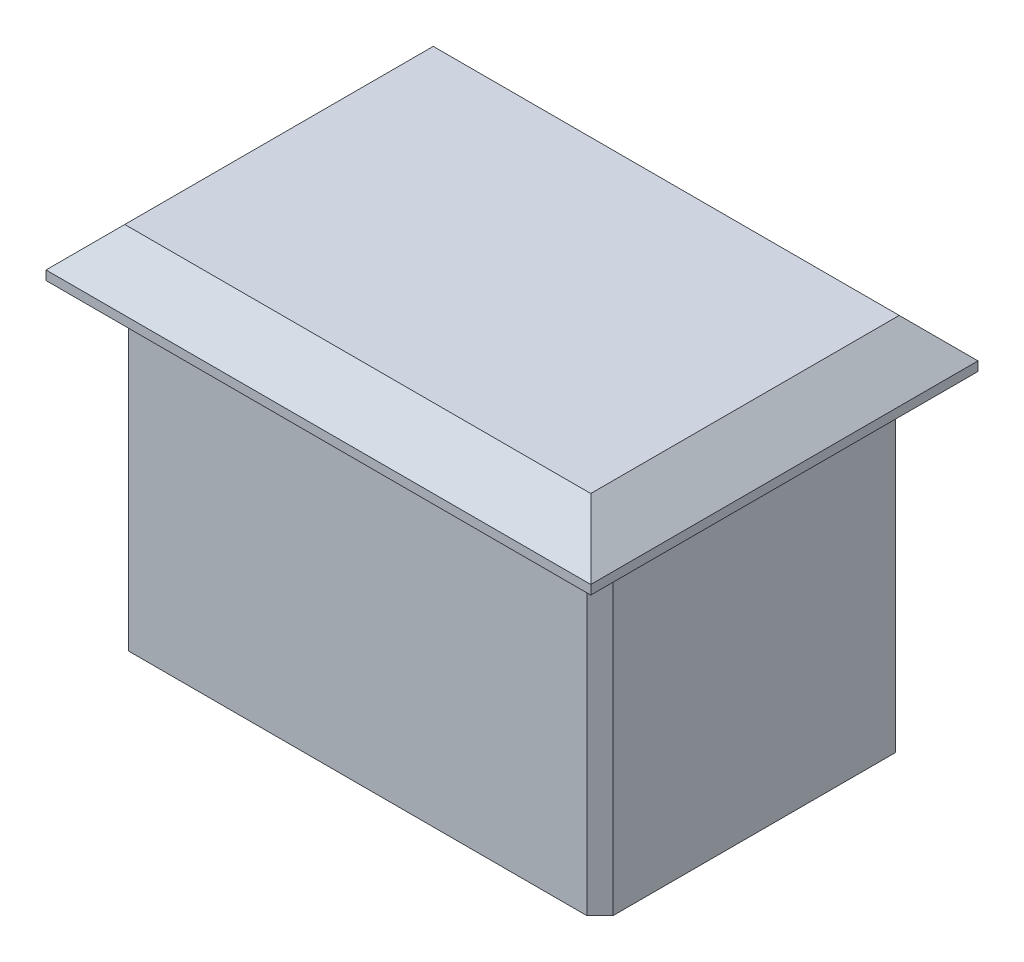
ISO-10303-21;
HEADER;
FILE_DESCRIPTION(('STEP AP214'),'2;1');
FILE_NAME('part.step','',(''),(''),'','','');
FILE_SCHEMA(('AUTOMOTIVE_DESIGN { 1 0 10303 214 1 1 1 1 }'));
ENDSEC;
DATA;
#1=APPLICATION_CONTEXT('core data for automotive mechanical design processes');
#2=APPLICATION_PROTOCOL_DEFINITION('international standard','automotive_design',2000,#1);
#3=PRODUCT_CONTEXT('',#1,'mechanical');
#4=PRODUCT('Part','Part','',(#3));
#5=PRODUCT_RELATED_PRODUCT_CATEGORY('part','',(#4));
#6=PRODUCT_DEFINITION_FORMATION('','',#4);
#7=PRODUCT_DEFINITION_CONTEXT('part definition',#1,'design');
#8=PRODUCT_DEFINITION('design','',#6,#7);
#9=PRODUCT_DEFINITION_SHAPE('','',#8);
#10=(LENGTH_UNIT() NAMED_UNIT(*) SI_UNIT(.MILLI.,.METRE.));
#11=(NAMED_UNIT(*) PLANE_ANGLE_UNIT() SI_UNIT($,.RADIAN.));
#12=(NAMED_UNIT(*) SI_UNIT($,.STERADIAN.) SOLID_ANGLE_UNIT());
#13=UNCERTAINTY_MEASURE_WITH_UNIT(LENGTH_MEASURE(1.E-05),#10,'distance_accuracy_value','');
#14=(GEOMETRIC_REPRESENTATION_CONTEXT(3) GLOBAL_UNCERTAINTY_ASSIGNED_CONTEXT((#13)) GLOBAL_UNIT_ASSIGNED_CONTEXT((#10,
#11,#12)) REPRESENTATION_CONTEXT('',''));
#15=CARTESIAN_POINT('',(0.,0.,0.));
#16=DIRECTION('',(0.,0.,1.));
#17=DIRECTION('',(1.,0.,0.));
#18=AXIS2_PLACEMENT_3D('',#15,#16,#17);
#19=CARTESIAN_POINT('',(-9.225,14.,-5.875));
#20=DIRECTION('',(1.,0.,0.));
#21=DIRECTION('',(0.,0.,-1.));
#22=AXIS2_PLACEMENT_3D('',#19,#20,#21);
#23=PLANE('',#22);
#24=DIRECTION('',(0.,0.,-1.));
#25=VECTOR('',#24,1.);
#26=CARTESIAN_POINT('',(-9.225,12.15,-5.875));
#27=LINE('',#26,#25);
#28=CARTESIAN_POINT('',(-9.225,12.15,5.375));
#29=VERTEX_POINT('',#28);
#30=CARTESIAN_POINT('',(-9.225,12.15,-5.375));
#31=VERTEX_POINT('',#30);
#32=EDGE_CURVE('E190',#29,#31,#27,.T.);
#33=ORIENTED_EDGE('',*,*,#32,.T.);
#34=DIRECTION('',(0.,-1.,0.));
#35=VECTOR('',#34,1.);
#36=CARTESIAN_POINT('',(-9.225,14.,-5.375));
#37=LINE('',#36,#35);
#38=CARTESIAN_POINT('',(-9.225,0.,-5.375));
#39=VERTEX_POINT('',#38);
#40=EDGE_CURVE('E248',#31,#39,#37,.T.);
#41=ORIENTED_EDGE('',*,*,#40,.T.);
#42=DIRECTION('',(0.,0.,1.));
#43=VECTOR('',#42,1.);
#44=CARTESIAN_POINT('',(-9.225,0.,-5.875));
#45=LINE('',#44,#43);
#46=CARTESIAN_POINT('',(-9.225,0.,5.375));
#47=VERTEX_POINT('',#46);
#48=EDGE_CURVE('E188',#39,#47,#45,.T.);
#49=ORIENTED_EDGE('',*,*,#48,.T.);
#50=DIRECTION('',(0.,1.,0.));
#51=VECTOR('',#50,1.);
#52=CARTESIAN_POINT('',(-9.225,14.,5.375));
#53=LINE('',#52,#51);
#54=EDGE_CURVE('E65',#47,#29,#53,.T.);
#55=ORIENTED_EDGE('',*,*,#54,.T.);
#56=EDGE_LOOP('',(#33,#41,#49,#55));
#57=FACE_BOUND('',#56,.T.);
#58=ADVANCED_FACE('F37',(#57),#23,.F.);
#59=CARTESIAN_POINT('',(9.225,14.,5.875));
#60=DIRECTION('',(0.,0.,-1.));
#61=DIRECTION('',(-1.,0.,0.));
#62=AXIS2_PLACEMENT_3D('',#59,#60,#61);
#63=PLANE('',#62);
#64=DIRECTION('',(1.,0.,0.));
#65=VECTOR('',#64,1.);
#66=CARTESIAN_POINT('',(9.225,0.,5.875));
#67=LINE('',#66,#65);
#68=CARTESIAN_POINT('',(-8.72500000000001,0.,5.875));
#69=VERTEX_POINT('',#68);
#70=CARTESIAN_POINT('',(8.72499999999999,0.,5.875));
#71=VERTEX_POINT('',#70);
#72=EDGE_CURVE('E192',#69,#71,#67,.T.);
#73=ORIENTED_EDGE('',*,*,#72,.T.);
#74=DIRECTION('',(0.,1.,0.));
#75=VECTOR('',#74,1.);
#76=CARTESIAN_POINT('',(8.72499999999999,14.,5.875));
#77=LINE('',#76,#75);
#78=CARTESIAN_POINT('',(8.72499999999999,12.15,5.875));
#79=VERTEX_POINT('',#78);
#80=EDGE_CURVE('E250',#71,#79,#77,.T.);
#81=ORIENTED_EDGE('',*,*,#80,.T.);
#82=DIRECTION('',(-1.,0.,0.));
#83=VECTOR('',#82,1.);
#84=CARTESIAN_POINT('',(9.225,12.15,5.875));
#85=LINE('',#84,#83);
#86=CARTESIAN_POINT('',(-8.72500000000001,12.15,5.875));
#87=VERTEX_POINT('',#86);
#88=EDGE_CURVE('E184',#79,#87,#85,.T.);
#89=ORIENTED_EDGE('',*,*,#88,.T.);
#90=DIRECTION('',(0.,-1.,0.));
#91=VECTOR('',#90,1.);
#92=CARTESIAN_POINT('',(-8.72500000000001,14.,5.875));
#93=LINE('',#92,#91);
#94=EDGE_CURVE('E243',#87,#69,#93,.T.);
#95=ORIENTED_EDGE('',*,*,#94,.T.);
#96=EDGE_LOOP('',(#73,#81,#89,#95));
#97=FACE_BOUND('',#96,.T.);
#98=ADVANCED_FACE('F272',(#97),#63,.F.);
#99=CARTESIAN_POINT('',(9.22499999999999,14.,-5.875));
#100=DIRECTION('',(-1.,0.,0.));
#101=DIRECTION('',(0.,0.,1.));
#102=AXIS2_PLACEMENT_3D('',#99,#100,#101);
#103=PLANE('',#102);
#104=DIRECTION('',(0.,0.,-1.));
#105=VECTOR('',#104,1.);
#106=CARTESIAN_POINT('',(9.22499999999999,0.,-5.875));
#107=LINE('',#106,#105);
#108=CARTESIAN_POINT('',(9.225,0.,5.375));
#109=VERTEX_POINT('',#108);
#110=CARTESIAN_POINT('',(9.22499999999999,0.,-5.375));
#111=VERTEX_POINT('',#110);
#112=EDGE_CURVE('E191',#109,#111,#107,.T.);
#113=ORIENTED_EDGE('',*,*,#112,.T.);
#114=DIRECTION('',(0.,1.,0.));
#115=VECTOR('',#114,1.);
#116=CARTESIAN_POINT('',(9.22499999999999,14.,-5.375));
#117=LINE('',#116,#115);
#118=CARTESIAN_POINT('',(9.22499999999999,12.15,-5.375));
#119=VERTEX_POINT('',#118);
#120=EDGE_CURVE('E245',#111,#119,#117,.T.);
#121=ORIENTED_EDGE('',*,*,#120,.T.);
#122=DIRECTION('',(0.,0.,1.));
#123=VECTOR('',#122,1.);
#124=CARTESIAN_POINT('',(9.22499999999999,12.15,-5.875));
#125=LINE('',#124,#123);
#126=CARTESIAN_POINT('',(9.225,12.15,5.375));
#127=VERTEX_POINT('',#126);
#128=EDGE_CURVE('E180',#119,#127,#125,.T.);
#129=ORIENTED_EDGE('',*,*,#128,.T.);
#130=DIRECTION('',(0.,-1.,0.));
#131=VECTOR('',#130,1.);
#132=CARTESIAN_POINT('',(9.225,14.,5.375));
#133=LINE('',#132,#131);
#134=EDGE_CURVE('E239',#127,#109,#133,.T.);
#135=ORIENTED_EDGE('',*,*,#134,.T.);
#136=EDGE_LOOP('',(#113,#121,#129,#135));
#137=FACE_BOUND('',#136,.T.);
#138=ADVANCED_FACE('F262',(#137),#103,.F.);
#139=CARTESIAN_POINT('',(9.22499999999999,14.,-5.875));
#140=DIRECTION('',(0.,0.,1.));
#141=DIRECTION('',(1.,0.,0.));
#142=AXIS2_PLACEMENT_3D('',#139,#140,#141);
#143=PLANE('',#142);
#144=DIRECTION('',(1.,0.,0.));
#145=VECTOR('',#144,1.);
#146=CARTESIAN_POINT('',(9.22499999999999,12.15,-5.875));
#147=LINE('',#146,#145);
#148=CARTESIAN_POINT('',(-8.725,12.15,-5.875));
#149=VERTEX_POINT('',#148);
#150=CARTESIAN_POINT('',(8.725,12.15,-5.875));
#151=VERTEX_POINT('',#150);
#152=EDGE_CURVE('E199',#149,#151,#147,.T.);
#153=ORIENTED_EDGE('',*,*,#152,.T.);
#154=DIRECTION('',(0.,-1.,0.));
#155=VECTOR('',#154,1.);
#156=CARTESIAN_POINT('',(8.725,14.,-5.875));
#157=LINE('',#156,#155);
#158=CARTESIAN_POINT('',(8.725,0.,-5.875));
#159=VERTEX_POINT('',#158);
#160=EDGE_CURVE('E227',#151,#159,#157,.T.);
#161=ORIENTED_EDGE('',*,*,#160,.T.);
#162=DIRECTION('',(-1.,0.,0.));
#163=VECTOR('',#162,1.);
#164=CARTESIAN_POINT('',(9.22499999999999,0.,-5.875));
#165=LINE('',#164,#163);
#166=CARTESIAN_POINT('',(-8.725,0.,-5.875));
#167=VERTEX_POINT('',#166);
#168=EDGE_CURVE('E197',#159,#167,#165,.T.);
#169=ORIENTED_EDGE('',*,*,#168,.T.);
#170=DIRECTION('',(0.,1.,0.));
#171=VECTOR('',#170,1.);
#172=CARTESIAN_POINT('',(-8.725,14.,-5.875));
#173=LINE('',#172,#171);
#174=EDGE_CURVE('E219',#167,#149,#173,.T.);
#175=ORIENTED_EDGE('',*,*,#174,.T.);
#176=EDGE_LOOP('',(#153,#161,#169,#175));
#177=FACE_BOUND('',#176,.T.);
#178=ADVANCED_FACE('F282',(#177),#143,.F.);
#179=CARTESIAN_POINT('',(0.,0.,0.));
#180=DIRECTION('',(0.,-1.,0.));
#181=DIRECTION('',(0.,0.,-1.));
#182=AXIS2_PLACEMENT_3D('',#179,#180,#181);
#183=PLANE('',#182);
#184=ORIENTED_EDGE('',*,*,#168,.F.);
#185=DIRECTION('',(-0.707106781186545,0.,-0.70710678118655));
#186=VECTOR('',#185,1.);
#187=CARTESIAN_POINT('',(7.30000000000003,0.,-7.29999999999998));
#188=LINE('',#187,#186);
#189=EDGE_CURVE('E240',#159,#111,#188,.F.);
#190=ORIENTED_EDGE('',*,*,#189,.T.);
#191=ORIENTED_EDGE('',*,*,#112,.F.);
#192=DIRECTION('',(0.70710678118655,0.,-0.707106781186545));
#193=VECTOR('',#192,1.);
#194=CARTESIAN_POINT('',(7.29999999999997,0.,7.30000000000002));
#195=LINE('',#194,#193);
#196=EDGE_CURVE('E233',#109,#71,#195,.F.);
#197=ORIENTED_EDGE('',*,*,#196,.T.);
#198=ORIENTED_EDGE('',*,*,#72,.F.);
#199=DIRECTION('',(0.707106781186544,0.,0.707106781186551));
#200=VECTOR('',#199,1.);
#201=CARTESIAN_POINT('',(-7.30000000000005,0.,7.29999999999997));
#202=LINE('',#201,#200);
#203=EDGE_CURVE('E232',#69,#47,#202,.F.);
#204=ORIENTED_EDGE('',*,*,#203,.T.);
#205=ORIENTED_EDGE('',*,*,#48,.F.);
#206=DIRECTION('',(-0.70710678118655,0.,0.707106781186545));
#207=VECTOR('',#206,1.);
#208=CARTESIAN_POINT('',(-7.29999999999997,0.,-7.30000000000002));
#209=LINE('',#208,#207);
#210=EDGE_CURVE('E234',#39,#167,#209,.F.);
#211=ORIENTED_EDGE('',*,*,#210,.T.);
#212=EDGE_LOOP('',(#184,#190,#191,#197,#198,#204,#205,#211));
#213=FACE_BOUND('',#212,.T.);
#214=ADVANCED_FACE('F271',(#213),#183,.T.);
#215=CARTESIAN_POINT('',(0.,12.15,0.));
#216=DIRECTION('',(0.,-1.,0.));
#217=DIRECTION('',(0.,0.,-1.));
#218=AXIS2_PLACEMENT_3D('',#215,#216,#217);
#219=PLANE('',#218);
#220=DIRECTION('',(0.,0.,1.));
#221=VECTOR('',#220,1.);
#222=CARTESIAN_POINT('',(-10.375,12.15,-7.375));
#223=LINE('',#222,#221);
#224=CARTESIAN_POINT('',(-10.375,12.15,-7.375));
#225=VERTEX_POINT('',#224);
#226=CARTESIAN_POINT('',(-10.375,12.15,7.375));
#227=VERTEX_POINT('',#226);
#228=EDGE_CURVE('E159',#225,#227,#223,.T.);
#229=ORIENTED_EDGE('',*,*,#228,.F.);
#230=DIRECTION('',(-1.,0.,0.));
#231=VECTOR('',#230,1.);
#232=CARTESIAN_POINT('',(10.375,12.15,-7.375));
#233=LINE('',#232,#231);
#234=CARTESIAN_POINT('',(10.375,12.15,-7.375));
#235=VERTEX_POINT('',#234);
#236=EDGE_CURVE('E153',#235,#225,#233,.T.);
#237=ORIENTED_EDGE('',*,*,#236,.F.);
#238=DIRECTION('',(0.,0.,-1.));
#239=VECTOR('',#238,1.);
#240=CARTESIAN_POINT('',(10.375,12.15,-7.375));
#241=LINE('',#240,#239);
#242=CARTESIAN_POINT('',(10.375,12.15,7.375));
#243=VERTEX_POINT('',#242);
#244=EDGE_CURVE('E162',#243,#235,#241,.T.);
#245=ORIENTED_EDGE('',*,*,#244,.F.);
#246=DIRECTION('',(1.,0.,0.));
#247=VECTOR('',#246,1.);
#248=CARTESIAN_POINT('',(10.375,12.15,7.375));
#249=LINE('',#248,#247);
#250=EDGE_CURVE('E148',#227,#243,#249,.T.);
#251=ORIENTED_EDGE('',*,*,#250,.F.);
#252=EDGE_LOOP('',(#229,#237,#245,#251));
#253=FACE_BOUND('',#252,.T.);
#254=ORIENTED_EDGE('',*,*,#32,.F.);
#255=DIRECTION('',(-0.707106781186544,0.,-0.707106781186551));
#256=VECTOR('',#255,1.);
#257=CARTESIAN_POINT('',(-8.72500000000001,12.15,5.875));
#258=LINE('',#257,#256);
#259=EDGE_CURVE('E11',#29,#87,#258,.F.);
#260=ORIENTED_EDGE('',*,*,#259,.T.);
#261=ORIENTED_EDGE('',*,*,#88,.F.);
#262=DIRECTION('',(-0.70710678118655,0.,0.707106781186545));
#263=VECTOR('',#262,1.);
#264=CARTESIAN_POINT('',(9.225,12.15,5.375));
#265=LINE('',#264,#263);
#266=EDGE_CURVE('E254',#79,#127,#265,.F.);
#267=ORIENTED_EDGE('',*,*,#266,.T.);
#268=ORIENTED_EDGE('',*,*,#128,.F.);
#269=DIRECTION('',(0.707106781186545,0.,0.70710678118655));
#270=VECTOR('',#269,1.);
#271=CARTESIAN_POINT('',(8.725,12.15,-5.875));
#272=LINE('',#271,#270);
#273=EDGE_CURVE('E251',#119,#151,#272,.F.);
#274=ORIENTED_EDGE('',*,*,#273,.T.);
#275=ORIENTED_EDGE('',*,*,#152,.F.);
#276=DIRECTION('',(0.70710678118655,0.,-0.707106781186545));
#277=VECTOR('',#276,1.);
#278=CARTESIAN_POINT('',(-9.225,12.15,-5.375));
#279=LINE('',#278,#277);
#280=EDGE_CURVE('E47',#149,#31,#279,.F.);
#281=ORIENTED_EDGE('',*,*,#280,.T.);
#282=EDGE_LOOP('',(#254,#260,#261,#267,#268,#274,#275,#281));
#283=FACE_BOUND('',#282,.T.);
#284=ADVANCED_FACE('F158',(#253,#283),#219,.T.);
#285=CARTESIAN_POINT('',(-10.375,12.15,-7.375));
#286=DIRECTION('',(-1.,0.,0.));
#287=DIRECTION('',(0.,0.,1.));
#288=AXIS2_PLACEMENT_3D('',#285,#286,#287);
#289=PLANE('',#288);
#290=DIRECTION('',(0.,1.,0.));
#291=VECTOR('',#290,1.);
#292=CARTESIAN_POINT('',(-10.375,12.15,7.375));
#293=LINE('',#292,#291);
#294=CARTESIAN_POINT('',(-10.375,12.5,7.375));
#295=VERTEX_POINT('',#294);
#296=EDGE_CURVE('E142',#227,#295,#293,.T.);
#297=ORIENTED_EDGE('',*,*,#296,.T.);
#298=DIRECTION('',(0.,0.,-1.));
#299=VECTOR('',#298,1.);
#300=CARTESIAN_POINT('',(-10.375,12.5,-7.375));
#301=LINE('',#300,#299);
#302=CARTESIAN_POINT('',(-10.375,12.5,-7.375));
#303=VERTEX_POINT('',#302);
#304=EDGE_CURVE('E217',#295,#303,#301,.T.);
#305=ORIENTED_EDGE('',*,*,#304,.T.);
#306=DIRECTION('',(0.,1.,0.));
#307=VECTOR('',#306,1.);
#308=CARTESIAN_POINT('',(-10.375,12.15,-7.375));
#309=LINE('',#308,#307);
#310=EDGE_CURVE('E170',#225,#303,#309,.T.);
#311=ORIENTED_EDGE('',*,*,#310,.F.);
#312=ORIENTED_EDGE('',*,*,#228,.T.);
#313=EDGE_LOOP('',(#297,#305,#311,#312));
#314=FACE_BOUND('',#313,.T.);
#315=ADVANCED_FACE('F164',(#314),#289,.T.);
#316=CARTESIAN_POINT('',(10.375,12.15,-7.375));
#317=DIRECTION('',(0.,0.,-1.));
#318=DIRECTION('',(-1.,0.,0.));
#319=AXIS2_PLACEMENT_3D('',#316,#317,#318);
#320=PLANE('',#319);
#321=ORIENTED_EDGE('',*,*,#310,.T.);
#322=DIRECTION('',(1.,0.,0.));
#323=VECTOR('',#322,1.);
#324=CARTESIAN_POINT('',(10.375,12.5,-7.375));
#325=LINE('',#324,#323);
#326=CARTESIAN_POINT('',(10.375,12.5,-7.375));
#327=VERTEX_POINT('',#326);
#328=EDGE_CURVE('E215',#303,#327,#325,.T.);
#329=ORIENTED_EDGE('',*,*,#328,.T.);
#330=DIRECTION('',(0.,1.,0.));
#331=VECTOR('',#330,1.);
#332=CARTESIAN_POINT('',(10.375,12.15,-7.375));
#333=LINE('',#332,#331);
#334=EDGE_CURVE('E179',#235,#327,#333,.T.);
#335=ORIENTED_EDGE('',*,*,#334,.F.);
#336=ORIENTED_EDGE('',*,*,#236,.T.);
#337=EDGE_LOOP('',(#321,#329,#335,#336));
#338=FACE_BOUND('',#337,.T.);
#339=ADVANCED_FACE('F344',(#338),#320,.T.);
#340=CARTESIAN_POINT('',(10.375,12.15,-7.375));
#341=DIRECTION('',(1.,0.,0.));
#342=DIRECTION('',(0.,0.,-1.));
#343=AXIS2_PLACEMENT_3D('',#340,#341,#342);
#344=PLANE('',#343);
#345=ORIENTED_EDGE('',*,*,#334,.T.);
#346=DIRECTION('',(0.,0.,1.));
#347=VECTOR('',#346,1.);
#348=CARTESIAN_POINT('',(10.375,12.5,7.375));
#349=LINE('',#348,#347);
#350=CARTESIAN_POINT('',(10.375,12.5,7.375));
#351=VERTEX_POINT('',#350);
#352=EDGE_CURVE('E214',#327,#351,#349,.T.);
#353=ORIENTED_EDGE('',*,*,#352,.T.);
#354=DIRECTION('',(0.,1.,0.));
#355=VECTOR('',#354,1.);
#356=CARTESIAN_POINT('',(10.375,12.15,7.375));
#357=LINE('',#356,#355);
#358=EDGE_CURVE('E155',#243,#351,#357,.T.);
#359=ORIENTED_EDGE('',*,*,#358,.F.);
#360=ORIENTED_EDGE('',*,*,#244,.T.);
#361=EDGE_LOOP('',(#345,#353,#359,#360));
#362=FACE_BOUND('',#361,.T.);
#363=ADVANCED_FACE('F349',(#362),#344,.T.);
#364=CARTESIAN_POINT('',(10.375,12.15,7.375));
#365=DIRECTION('',(0.,0.,1.));
#366=DIRECTION('',(1.,0.,0.));
#367=AXIS2_PLACEMENT_3D('',#364,#365,#366);
#368=PLANE('',#367);
#369=ORIENTED_EDGE('',*,*,#358,.T.);
#370=DIRECTION('',(-1.,0.,0.));
#371=VECTOR('',#370,1.);
#372=CARTESIAN_POINT('',(-10.375,12.5,7.375));
#373=LINE('',#372,#371);
#374=EDGE_CURVE('E146',#351,#295,#373,.T.);
#375=ORIENTED_EDGE('',*,*,#374,.T.);
#376=ORIENTED_EDGE('',*,*,#296,.F.);
#377=ORIENTED_EDGE('',*,*,#250,.T.);
#378=EDGE_LOOP('',(#369,#375,#376,#377));
#379=FACE_BOUND('',#378,.T.);
#380=ADVANCED_FACE('F144',(#379),#368,.T.);
#381=CARTESIAN_POINT('',(0.,14.,0.));
#382=DIRECTION('',(0.,-1.,0.));
#383=DIRECTION('',(0.,0.,-1.));
#384=AXIS2_PLACEMENT_3D('',#381,#382,#383);
#385=PLANE('',#384);
#386=DIRECTION('',(0.,0.,-1.));
#387=VECTOR('',#386,1.);
#388=CARTESIAN_POINT('',(8.875,14.,-7.375));
#389=LINE('',#388,#387);
#390=CARTESIAN_POINT('',(8.875,14.,5.875));
#391=VERTEX_POINT('',#390);
#392=CARTESIAN_POINT('',(8.875,14.,-5.875));
#393=VERTEX_POINT('',#392);
#394=EDGE_CURVE('E210',#391,#393,#389,.T.);
#395=ORIENTED_EDGE('',*,*,#394,.T.);
#396=DIRECTION('',(-1.,0.,0.));
#397=VECTOR('',#396,1.);
#398=CARTESIAN_POINT('',(-10.375,14.,-5.875));
#399=LINE('',#398,#397);
#400=CARTESIAN_POINT('',(-8.875,14.,-5.875));
#401=VERTEX_POINT('',#400);
#402=EDGE_CURVE('E207',#393,#401,#399,.T.);
#403=ORIENTED_EDGE('',*,*,#402,.T.);
#404=DIRECTION('',(0.,0.,1.));
#405=VECTOR('',#404,1.);
#406=CARTESIAN_POINT('',(-8.875,14.,7.375));
#407=LINE('',#406,#405);
#408=CARTESIAN_POINT('',(-8.875,14.,5.875));
#409=VERTEX_POINT('',#408);
#410=EDGE_CURVE('E201',#401,#409,#407,.T.);
#411=ORIENTED_EDGE('',*,*,#410,.T.);
#412=DIRECTION('',(1.,0.,0.));
#413=VECTOR('',#412,1.);
#414=CARTESIAN_POINT('',(10.375,14.,5.875));
#415=LINE('',#414,#413);
#416=EDGE_CURVE('E202',#409,#391,#415,.T.);
#417=ORIENTED_EDGE('',*,*,#416,.T.);
#418=EDGE_LOOP('',(#395,#403,#411,#417));
#419=FACE_BOUND('',#418,.T.);
#420=ADVANCED_FACE('F328',(#419),#385,.F.);
#421=CARTESIAN_POINT('',(0.,14.,5.875));
#422=DIRECTION('',(0.,0.707106781186547,0.707106781186548));
#423=DIRECTION('',(-1.,0.,0.));
#424=AXIS2_PLACEMENT_3D('',#421,#422,#423);
#425=PLANE('',#424);
#426=DIRECTION('',(0.577350269189625,0.577350269189627,-0.577350269189625));
#427=VECTOR('',#426,1.);
#428=CARTESIAN_POINT('',(-6.91666666666667,15.9583333333333,3.91666666666667));
#429=LINE('',#428,#427);
#430=EDGE_CURVE('E171',#295,#409,#429,.T.);
#431=ORIENTED_EDGE('',*,*,#430,.F.);
#432=ORIENTED_EDGE('',*,*,#374,.F.);
#433=DIRECTION('',(-0.577350269189625,0.577350269189627,-0.577350269189626));
#434=VECTOR('',#433,1.);
#435=CARTESIAN_POINT('',(5.91666666666668,16.9583333333333,2.91666666666667));
#436=LINE('',#435,#434);
#437=EDGE_CURVE('E169',#391,#351,#436,.F.);
#438=ORIENTED_EDGE('',*,*,#437,.F.);
#439=ORIENTED_EDGE('',*,*,#416,.F.);
#440=EDGE_LOOP('',(#431,#432,#438,#439));
#441=FACE_BOUND('',#440,.T.);
#442=ADVANCED_FACE('F322',(#441),#425,.T.);
#443=CARTESIAN_POINT('',(8.875,14.,0.));
#444=DIRECTION('',(0.707106781186549,0.707106781186546,0.));
#445=DIRECTION('',(0.,0.,1.));
#446=AXIS2_PLACEMENT_3D('',#443,#444,#445);
#447=PLANE('',#446);
#448=ORIENTED_EDGE('',*,*,#437,.T.);
#449=ORIENTED_EDGE('',*,*,#352,.F.);
#450=DIRECTION('',(-0.577350269189625,0.577350269189627,0.577350269189626));
#451=VECTOR('',#450,1.);
#452=CARTESIAN_POINT('',(6.91666666666667,15.9583333333333,-3.91666666666667));
#453=LINE('',#452,#451);
#454=EDGE_CURVE('E224',#393,#327,#453,.F.);
#455=ORIENTED_EDGE('',*,*,#454,.F.);
#456=ORIENTED_EDGE('',*,*,#394,.F.);
#457=EDGE_LOOP('',(#448,#449,#455,#456));
#458=FACE_BOUND('',#457,.T.);
#459=ADVANCED_FACE('F318',(#458),#447,.T.);
#460=CARTESIAN_POINT('',(-8.875,14.,0.));
#461=DIRECTION('',(-0.707106781186548,0.707106781186547,0.));
#462=DIRECTION('',(0.,0.,-1.));
#463=AXIS2_PLACEMENT_3D('',#460,#461,#462);
#464=PLANE('',#463);
#465=ORIENTED_EDGE('',*,*,#430,.T.);
#466=ORIENTED_EDGE('',*,*,#410,.F.);
#467=DIRECTION('',(-0.577350269189626,-0.577350269189627,-0.577350269189625));
#468=VECTOR('',#467,1.);
#469=CARTESIAN_POINT('',(-6.91666666666667,15.9583333333333,-3.91666666666667));
#470=LINE('',#469,#468);
#471=EDGE_CURVE('E222',#303,#401,#470,.F.);
#472=ORIENTED_EDGE('',*,*,#471,.F.);
#473=ORIENTED_EDGE('',*,*,#304,.F.);
#474=EDGE_LOOP('',(#465,#466,#472,#473));
#475=FACE_BOUND('',#474,.T.);
#476=ADVANCED_FACE('F296',(#475),#464,.T.);
#477=CARTESIAN_POINT('',(0.,14.,-5.875));
#478=DIRECTION('',(0.,0.707106781186547,-0.707106781186548));
#479=DIRECTION('',(1.,0.,0.));
#480=AXIS2_PLACEMENT_3D('',#477,#478,#479);
#481=PLANE('',#480);
#482=ORIENTED_EDGE('',*,*,#454,.T.);
#483=ORIENTED_EDGE('',*,*,#328,.F.);
#484=ORIENTED_EDGE('',*,*,#471,.T.);
#485=ORIENTED_EDGE('',*,*,#402,.F.);
#486=EDGE_LOOP('',(#482,#483,#484,#485));
#487=FACE_BOUND('',#486,.T.);
#488=ADVANCED_FACE('F289',(#487),#481,.T.);
#489=CARTESIAN_POINT('',(8.725,14.,-5.875));
#490=DIRECTION('',(-0.70710678118655,0.,0.707106781186545));
#491=DIRECTION('',(0.,-1.,0.));
#492=AXIS2_PLACEMENT_3D('',#489,#490,#491);
#493=PLANE('',#492);
#494=ORIENTED_EDGE('',*,*,#273,.F.);
#495=ORIENTED_EDGE('',*,*,#120,.F.);
#496=ORIENTED_EDGE('',*,*,#189,.F.);
#497=ORIENTED_EDGE('',*,*,#160,.F.);
#498=EDGE_LOOP('',(#494,#495,#496,#497));
#499=FACE_BOUND('',#498,.T.);
#500=ADVANCED_FACE('F287',(#499),#493,.F.);
#501=CARTESIAN_POINT('',(9.225,14.,5.375));
#502=DIRECTION('',(-0.707106781186545,0.,-0.70710678118655));
#503=DIRECTION('',(0.,-1.,0.));
#504=AXIS2_PLACEMENT_3D('',#501,#502,#503);
#505=PLANE('',#504);
#506=ORIENTED_EDGE('',*,*,#266,.F.);
#507=ORIENTED_EDGE('',*,*,#80,.F.);
#508=ORIENTED_EDGE('',*,*,#196,.F.);
#509=ORIENTED_EDGE('',*,*,#134,.F.);
#510=EDGE_LOOP('',(#506,#507,#508,#509));
#511=FACE_BOUND('',#510,.T.);
#512=ADVANCED_FACE('F270',(#511),#505,.F.);
#513=CARTESIAN_POINT('',(-9.225,14.,-5.375));
#514=DIRECTION('',(0.707106781186545,0.,0.70710678118655));
#515=DIRECTION('',(0.,-1.,0.));
#516=AXIS2_PLACEMENT_3D('',#513,#514,#515);
#517=PLANE('',#516);
#518=ORIENTED_EDGE('',*,*,#280,.F.);
#519=ORIENTED_EDGE('',*,*,#174,.F.);
#520=ORIENTED_EDGE('',*,*,#210,.F.);
#521=ORIENTED_EDGE('',*,*,#40,.F.);
#522=EDGE_LOOP('',(#518,#519,#520,#521));
#523=FACE_BOUND('',#522,.T.);
#524=ADVANCED_FACE('F278',(#523),#517,.F.);
#525=CARTESIAN_POINT('',(-8.72500000000001,14.,5.875));
#526=DIRECTION('',(0.707106781186551,0.,-0.707106781186544));
#527=DIRECTION('',(0.,-1.,0.));
#528=AXIS2_PLACEMENT_3D('',#525,#526,#527);
#529=PLANE('',#528);
#530=ORIENTED_EDGE('',*,*,#259,.F.);
#531=ORIENTED_EDGE('',*,*,#54,.F.);
#532=ORIENTED_EDGE('',*,*,#203,.F.);
#533=ORIENTED_EDGE('',*,*,#94,.F.);
#534=EDGE_LOOP('',(#530,#531,#532,#533));
#535=FACE_BOUND('',#534,.T.);
#536=ADVANCED_FACE('F43',(#535),#529,.F.);
#537=CLOSED_SHELL('',(#58,#98,#138,#178,#214,#284,#315,#339,#363,#380,#420,#442,#459,#476,#488,
#500,#512,#524,#536));
#538=MANIFOLD_SOLID_BREP('B2',#537);
#539=ADVANCED_BREP_SHAPE_REPRESENTATION('',(#18,#538),#14);
#540=SHAPE_DEFINITION_REPRESENTATION(#9,#539);
ENDSEC;
END-ISO-10303-21;
